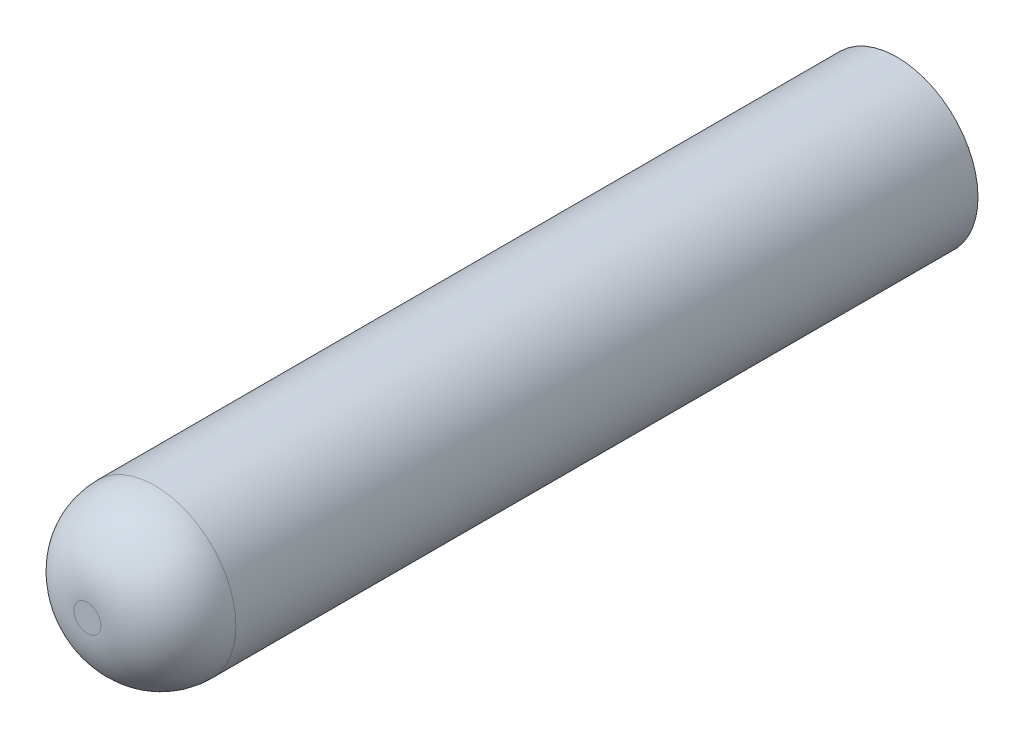
ISO-10303-21;
HEADER;
FILE_DESCRIPTION(('STEP AP214'),'2;1');
FILE_NAME('part.step','',(''),(''),'','','');
FILE_SCHEMA(('AUTOMOTIVE_DESIGN { 1 0 10303 214 1 1 1 1 }'));
ENDSEC;
DATA;
#1=APPLICATION_CONTEXT('core data for automotive mechanical design processes');
#2=APPLICATION_PROTOCOL_DEFINITION('international standard','automotive_design',2000,#1);
#3=PRODUCT_CONTEXT('',#1,'mechanical');
#4=PRODUCT('Part','Part','',(#3));
#5=PRODUCT_RELATED_PRODUCT_CATEGORY('part','',(#4));
#6=PRODUCT_DEFINITION_FORMATION('','',#4);
#7=PRODUCT_DEFINITION_CONTEXT('part definition',#1,'design');
#8=PRODUCT_DEFINITION('design','',#6,#7);
#9=PRODUCT_DEFINITION_SHAPE('','',#8);
#10=(LENGTH_UNIT() NAMED_UNIT(*) SI_UNIT(.MILLI.,.METRE.));
#11=(NAMED_UNIT(*) PLANE_ANGLE_UNIT() SI_UNIT($,.RADIAN.));
#12=(NAMED_UNIT(*) SI_UNIT($,.STERADIAN.) SOLID_ANGLE_UNIT());
#13=UNCERTAINTY_MEASURE_WITH_UNIT(LENGTH_MEASURE(1.E-05),#10,'distance_accuracy_value','');
#14=(GEOMETRIC_REPRESENTATION_CONTEXT(3) GLOBAL_UNCERTAINTY_ASSIGNED_CONTEXT((#13)) GLOBAL_UNIT_ASSIGNED_CONTEXT((#10,
#11,#12)) REPRESENTATION_CONTEXT('',''));
#15=CARTESIAN_POINT('',(0.,0.,0.));
#16=DIRECTION('',(0.,0.,1.));
#17=DIRECTION('',(1.,0.,0.));
#18=AXIS2_PLACEMENT_3D('',#15,#16,#17);
#19=CARTESIAN_POINT('',(0.,0.,60.));
#20=DIRECTION('',(0.,0.,-1.));
#21=DIRECTION('',(-1.,0.,0.));
#22=AXIS2_PLACEMENT_3D('',#19,#20,#21);
#23=CYLINDRICAL_SURFACE('',#22,6.);
#24=CARTESIAN_POINT('',(0.,0.,55.));
#25=DIRECTION('',(0.,0.,1.));
#26=DIRECTION('',(1.,0.,0.));
#27=AXIS2_PLACEMENT_3D('',#24,#25,#26);
#28=CIRCLE('',#27,6.);
#29=CARTESIAN_POINT('',(6.,0.,55.));
#30=VERTEX_POINT('',#29);
#31=EDGE_CURVE('E10',#30,#30,#28,.F.);
#32=ORIENTED_EDGE('',*,*,#31,.T.);
#33=EDGE_LOOP('',(#32));
#34=FACE_BOUND('',#33,.T.);
#35=CARTESIAN_POINT('',(0.,0.,0.));
#36=DIRECTION('',(0.,0.,1.));
#37=DIRECTION('',(1.,0.,0.));
#38=AXIS2_PLACEMENT_3D('',#35,#36,#37);
#39=CIRCLE('',#38,6.);
#40=CARTESIAN_POINT('',(6.,0.,0.));
#41=VERTEX_POINT('',#40);
#42=EDGE_CURVE('E50',#41,#41,#39,.T.);
#43=ORIENTED_EDGE('',*,*,#42,.T.);
#44=EDGE_LOOP('',(#43));
#45=FACE_BOUND('',#44,.T.);
#46=ADVANCED_FACE('F37',(#34,#45),#23,.T.);
#47=CARTESIAN_POINT('',(0.,0.,60.));
#48=DIRECTION('',(0.,0.,1.));
#49=DIRECTION('',(1.,0.,0.));
#50=AXIS2_PLACEMENT_3D('',#47,#48,#49);
#51=PLANE('',#50);
#52=CARTESIAN_POINT('',(0.,0.,60.));
#53=DIRECTION('',(0.,0.,1.));
#54=DIRECTION('',(1.,0.,0.));
#55=AXIS2_PLACEMENT_3D('',#52,#53,#54);
#56=CIRCLE('',#55,0.999999999999999);
#57=CARTESIAN_POINT('',(0.999999999999999,0.,60.));
#58=VERTEX_POINT('',#57);
#59=EDGE_CURVE('E45',#58,#58,#56,.T.);
#60=ORIENTED_EDGE('',*,*,#59,.T.);
#61=EDGE_LOOP('',(#60));
#62=FACE_BOUND('',#61,.T.);
#63=ADVANCED_FACE('F61',(#62),#51,.T.);
#64=CARTESIAN_POINT('',(0.,0.,0.));
#65=DIRECTION('',(0.,0.,1.));
#66=DIRECTION('',(1.,0.,0.));
#67=AXIS2_PLACEMENT_3D('',#64,#65,#66);
#68=PLANE('',#67);
#69=ORIENTED_EDGE('',*,*,#42,.F.);
#70=EDGE_LOOP('',(#69));
#71=FACE_BOUND('',#70,.T.);
#72=ADVANCED_FACE('F59',(#71),#68,.F.);
#73=CARTESIAN_POINT('',(0.,0.,55.));
#74=DIRECTION('',(0.,0.,1.));
#75=DIRECTION('',(1.,0.,0.));
#76=AXIS2_PLACEMENT_3D('',#73,#74,#75);
#77=DEGENERATE_TOROIDAL_SURFACE('',#76,0.999999999999999,5.,.T.);
#78=ORIENTED_EDGE('',*,*,#31,.F.);
#79=EDGE_LOOP('',(#78));
#80=FACE_BOUND('',#79,.T.);
#81=ORIENTED_EDGE('',*,*,#59,.F.);
#82=EDGE_LOOP('',(#81));
#83=FACE_BOUND('',#82,.T.);
#84=ADVANCED_FACE('F39',(#80,#83),#77,.T.);
#85=CLOSED_SHELL('',(#46,#63,#72,#84));
#86=MANIFOLD_SOLID_BREP('B2',#85);
#87=ADVANCED_BREP_SHAPE_REPRESENTATION('',(#18,#86),#14);
#88=SHAPE_DEFINITION_REPRESENTATION(#9,#87);
ENDSEC;
END-ISO-10303-21;
